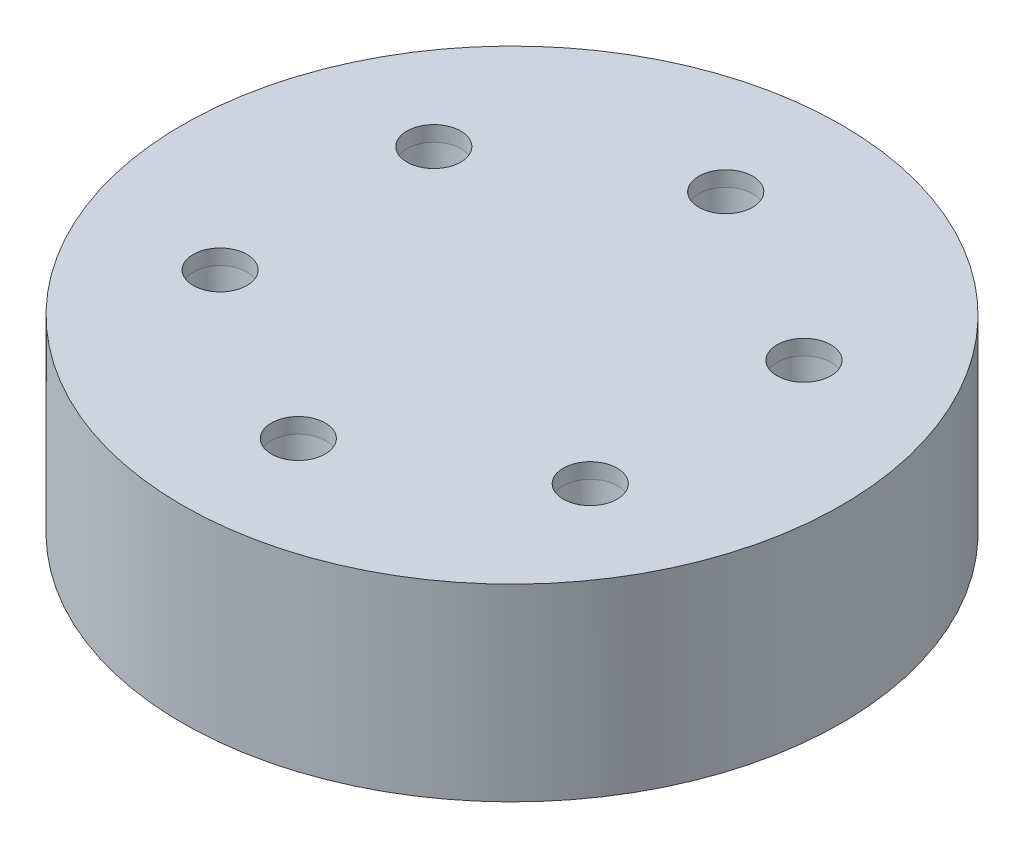
ISO-10303-21;
HEADER;
FILE_DESCRIPTION(('STEP AP214'),'2;1');
FILE_NAME('part.step','',(''),(''),'','','');
FILE_SCHEMA(('AUTOMOTIVE_DESIGN { 1 0 10303 214 1 1 1 1 }'));
ENDSEC;
DATA;
#1=APPLICATION_CONTEXT('core data for automotive mechanical design processes');
#2=APPLICATION_PROTOCOL_DEFINITION('international standard','automotive_design',2000,#1);
#3=PRODUCT_CONTEXT('',#1,'mechanical');
#4=PRODUCT('Part','Part','',(#3));
#5=PRODUCT_RELATED_PRODUCT_CATEGORY('part','',(#4));
#6=PRODUCT_DEFINITION_FORMATION('','',#4);
#7=PRODUCT_DEFINITION_CONTEXT('part definition',#1,'design');
#8=PRODUCT_DEFINITION('design','',#6,#7);
#9=PRODUCT_DEFINITION_SHAPE('','',#8);
#10=(LENGTH_UNIT() NAMED_UNIT(*) SI_UNIT(.MILLI.,.METRE.));
#11=(NAMED_UNIT(*) PLANE_ANGLE_UNIT() SI_UNIT($,.RADIAN.));
#12=(NAMED_UNIT(*) SI_UNIT($,.STERADIAN.) SOLID_ANGLE_UNIT());
#13=UNCERTAINTY_MEASURE_WITH_UNIT(LENGTH_MEASURE(1.E-05),#10,'distance_accuracy_value','');
#14=(GEOMETRIC_REPRESENTATION_CONTEXT(3) GLOBAL_UNCERTAINTY_ASSIGNED_CONTEXT((#13)) GLOBAL_UNIT_ASSIGNED_CONTEXT((#10,
#11,#12)) REPRESENTATION_CONTEXT('',''));
#15=CARTESIAN_POINT('',(0.,0.,0.));
#16=DIRECTION('',(0.,0.,1.));
#17=DIRECTION('',(1.,0.,0.));
#18=AXIS2_PLACEMENT_3D('',#15,#16,#17);
#19=CARTESIAN_POINT('',(0.,0.,0.));
#20=DIRECTION('',(0.,1.,0.));
#21=DIRECTION('',(0.,0.,1.));
#22=AXIS2_PLACEMENT_3D('',#19,#20,#21);
#23=PLANE('',#22);
#24=CARTESIAN_POINT('',(20.6114046100695,0.,-11.9000000000002));
#25=DIRECTION('',(0.,-1.,0.));
#26=DIRECTION('',(0.866025403784433,0.,-0.50000000000001));
#27=AXIS2_PLACEMENT_3D('',#24,#25,#26);
#28=CIRCLE('',#27,2.1);
#29=CARTESIAN_POINT('',(22.4300579580168,0.,-12.9500000000003));
#30=VERTEX_POINT('',#29);
#31=EDGE_CURVE('E165',#30,#30,#28,.T.);
#32=ORIENTED_EDGE('',*,*,#31,.F.);
#33=EDGE_LOOP('',(#32));
#34=FACE_BOUND('',#33,.T.);
#35=CARTESIAN_POINT('',(20.6114046100698,0.,11.8999999999998));
#36=DIRECTION('',(0.,-1.,0.));
#37=DIRECTION('',(0.866025403784443,0.,0.499999999999992));
#38=AXIS2_PLACEMENT_3D('',#35,#36,#37);
#39=CIRCLE('',#38,2.1);
#40=CARTESIAN_POINT('',(22.4300579580171,0.,12.9499999999998));
#41=VERTEX_POINT('',#40);
#42=EDGE_CURVE('E149',#41,#41,#39,.T.);
#43=ORIENTED_EDGE('',*,*,#42,.F.);
#44=EDGE_LOOP('',(#43));
#45=FACE_BOUND('',#44,.T.);
#46=CARTESIAN_POINT('',(0.,0.,23.8));
#47=DIRECTION('',(0.,-1.,0.));
#48=DIRECTION('',(0.,0.,1.));
#49=AXIS2_PLACEMENT_3D('',#46,#47,#48);
#50=CIRCLE('',#49,2.1);
#51=CARTESIAN_POINT('',(0.,0.,25.9));
#52=VERTEX_POINT('',#51);
#53=EDGE_CURVE('E133',#52,#52,#50,.T.);
#54=ORIENTED_EDGE('',*,*,#53,.F.);
#55=EDGE_LOOP('',(#54));
#56=FACE_BOUND('',#55,.T.);
#57=CARTESIAN_POINT('',(-20.6114046100696,0.,11.9000000000001));
#58=DIRECTION('',(0.,-1.,0.));
#59=DIRECTION('',(-0.866025403784436,0.,0.500000000000004));
#60=AXIS2_PLACEMENT_3D('',#57,#58,#59);
#61=CIRCLE('',#60,2.1);
#62=CARTESIAN_POINT('',(-22.4300579580169,0.,12.9500000000001));
#63=VERTEX_POINT('',#62);
#64=EDGE_CURVE('E117',#63,#63,#61,.T.);
#65=ORIENTED_EDGE('',*,*,#64,.F.);
#66=EDGE_LOOP('',(#65));
#67=FACE_BOUND('',#66,.T.);
#68=CARTESIAN_POINT('',(-20.6114046100697,0.,-11.9));
#69=DIRECTION('',(0.,-1.,0.));
#70=DIRECTION('',(-0.86602540378444,0.,-0.499999999999998));
#71=AXIS2_PLACEMENT_3D('',#68,#69,#70);
#72=CIRCLE('',#71,2.1);
#73=CARTESIAN_POINT('',(-22.430057958017,0.,-12.95));
#74=VERTEX_POINT('',#73);
#75=EDGE_CURVE('E101',#74,#74,#72,.T.);
#76=ORIENTED_EDGE('',*,*,#75,.F.);
#77=EDGE_LOOP('',(#76));
#78=FACE_BOUND('',#77,.T.);
#79=CARTESIAN_POINT('',(0.,0.,-23.8));
#80=DIRECTION('',(0.,-1.,0.));
#81=DIRECTION('',(0.,0.,-1.));
#82=AXIS2_PLACEMENT_3D('',#79,#80,#81);
#83=CIRCLE('',#82,2.1);
#84=CARTESIAN_POINT('',(0.,0.,-25.9));
#85=VERTEX_POINT('',#84);
#86=EDGE_CURVE('E65',#85,#85,#83,.T.);
#87=ORIENTED_EDGE('',*,*,#86,.F.);
#88=EDGE_LOOP('',(#87));
#89=FACE_BOUND('',#88,.T.);
#90=CARTESIAN_POINT('',(0.,0.,0.));
#91=DIRECTION('',(0.,-1.,0.));
#92=DIRECTION('',(0.,0.,-1.));
#93=AXIS2_PLACEMENT_3D('',#90,#91,#92);
#94=CIRCLE('',#93,14.1);
#95=CARTESIAN_POINT('',(0.,0.,-14.1));
#96=VERTEX_POINT('',#95);
#97=EDGE_CURVE('E70',#96,#96,#94,.T.);
#98=ORIENTED_EDGE('',*,*,#97,.F.);
#99=EDGE_LOOP('',(#98));
#100=FACE_BOUND('',#99,.T.);
#101=CARTESIAN_POINT('',(0.,0.,0.));
#102=DIRECTION('',(0.,-1.,0.));
#103=DIRECTION('',(0.,0.,-1.));
#104=AXIS2_PLACEMENT_3D('',#101,#102,#103);
#105=CIRCLE('',#104,31.7);
#106=CARTESIAN_POINT('',(0.,0.,-31.7));
#107=VERTEX_POINT('',#106);
#108=EDGE_CURVE('E82',#107,#107,#105,.T.);
#109=ORIENTED_EDGE('',*,*,#108,.T.);
#110=EDGE_LOOP('',(#109));
#111=FACE_BOUND('',#110,.T.);
#112=ADVANCED_FACE('F41',(#34,#45,#56,#67,#78,#89,#100,#111),#23,.F.);
#113=CARTESIAN_POINT('',(0.,11.,0.));
#114=DIRECTION('',(0.,-1.,0.));
#115=DIRECTION('',(0.,0.,-1.));
#116=AXIS2_PLACEMENT_3D('',#113,#114,#115);
#117=CYLINDRICAL_SURFACE('',#116,36.7);
#118=CARTESIAN_POINT('',(0.,11.,0.));
#119=DIRECTION('',(0.,1.,0.));
#120=DIRECTION('',(0.,0.,1.));
#121=AXIS2_PLACEMENT_3D('',#118,#119,#120);
#122=CIRCLE('',#121,36.7);
#123=CARTESIAN_POINT('',(0.,11.,36.7));
#124=VERTEX_POINT('',#123);
#125=EDGE_CURVE('E10',#124,#124,#122,.T.);
#126=ORIENTED_EDGE('',*,*,#125,.F.);
#127=EDGE_LOOP('',(#126));
#128=FACE_BOUND('',#127,.T.);
#129=CARTESIAN_POINT('',(0.,-10.,0.));
#130=DIRECTION('',(0.,-1.,0.));
#131=DIRECTION('',(0.,0.,-1.));
#132=AXIS2_PLACEMENT_3D('',#129,#130,#131);
#133=CIRCLE('',#132,36.7);
#134=CARTESIAN_POINT('',(0.,-10.,-36.7));
#135=VERTEX_POINT('',#134);
#136=EDGE_CURVE('E74',#135,#135,#133,.T.);
#137=ORIENTED_EDGE('',*,*,#136,.F.);
#138=EDGE_LOOP('',(#137));
#139=FACE_BOUND('',#138,.T.);
#140=ADVANCED_FACE('F43',(#128,#139),#117,.T.);
#141=CARTESIAN_POINT('',(0.,11.,0.));
#142=DIRECTION('',(0.,1.,0.));
#143=DIRECTION('',(0.,0.,1.));
#144=AXIS2_PLACEMENT_3D('',#141,#142,#143);
#145=PLANE('',#144);
#146=CARTESIAN_POINT('',(20.6114046100695,11.,-11.9000000000002));
#147=DIRECTION('',(0.,-1.,0.));
#148=DIRECTION('',(0.866025403784433,0.,-0.50000000000001));
#149=AXIS2_PLACEMENT_3D('',#146,#147,#148);
#150=CIRCLE('',#149,3.);
#151=CARTESIAN_POINT('',(23.2094808214228,11.,-13.4000000000003));
#152=VERTEX_POINT('',#151);
#153=EDGE_CURVE('E153',#152,#152,#150,.T.);
#154=ORIENTED_EDGE('',*,*,#153,.T.);
#155=EDGE_LOOP('',(#154));
#156=FACE_BOUND('',#155,.T.);
#157=CARTESIAN_POINT('',(20.6114046100698,11.,11.8999999999998));
#158=DIRECTION('',(0.,-1.,0.));
#159=DIRECTION('',(0.866025403784443,0.,0.499999999999992));
#160=AXIS2_PLACEMENT_3D('',#157,#158,#159);
#161=CIRCLE('',#160,3.);
#162=CARTESIAN_POINT('',(23.2094808214231,11.,13.3999999999998));
#163=VERTEX_POINT('',#162);
#164=EDGE_CURVE('E137',#163,#163,#161,.T.);
#165=ORIENTED_EDGE('',*,*,#164,.T.);
#166=EDGE_LOOP('',(#165));
#167=FACE_BOUND('',#166,.T.);
#168=CARTESIAN_POINT('',(0.,11.,23.8));
#169=DIRECTION('',(0.,-1.,0.));
#170=DIRECTION('',(0.,0.,1.));
#171=AXIS2_PLACEMENT_3D('',#168,#169,#170);
#172=CIRCLE('',#171,3.);
#173=CARTESIAN_POINT('',(0.,11.,26.8));
#174=VERTEX_POINT('',#173);
#175=EDGE_CURVE('E121',#174,#174,#172,.T.);
#176=ORIENTED_EDGE('',*,*,#175,.T.);
#177=EDGE_LOOP('',(#176));
#178=FACE_BOUND('',#177,.T.);
#179=CARTESIAN_POINT('',(-20.6114046100696,11.,11.9000000000001));
#180=DIRECTION('',(0.,-1.,0.));
#181=DIRECTION('',(-0.866025403784436,0.,0.500000000000004));
#182=AXIS2_PLACEMENT_3D('',#179,#180,#181);
#183=CIRCLE('',#182,3.);
#184=CARTESIAN_POINT('',(-23.2094808214229,11.,13.4000000000001));
#185=VERTEX_POINT('',#184);
#186=EDGE_CURVE('E105',#185,#185,#183,.T.);
#187=ORIENTED_EDGE('',*,*,#186,.T.);
#188=EDGE_LOOP('',(#187));
#189=FACE_BOUND('',#188,.T.);
#190=CARTESIAN_POINT('',(-20.6114046100697,11.,-11.9));
#191=DIRECTION('',(0.,-1.,0.));
#192=DIRECTION('',(-0.86602540378444,0.,-0.499999999999998));
#193=AXIS2_PLACEMENT_3D('',#190,#191,#192);
#194=CIRCLE('',#193,3.);
#195=CARTESIAN_POINT('',(-23.209480821423,11.,-13.3999999999999));
#196=VERTEX_POINT('',#195);
#197=EDGE_CURVE('E86',#196,#196,#194,.T.);
#198=ORIENTED_EDGE('',*,*,#197,.T.);
#199=EDGE_LOOP('',(#198));
#200=FACE_BOUND('',#199,.T.);
#201=CARTESIAN_POINT('',(0.,11.,-23.8));
#202=DIRECTION('',(0.,-1.,0.));
#203=DIRECTION('',(0.,0.,-1.));
#204=AXIS2_PLACEMENT_3D('',#201,#202,#203);
#205=CIRCLE('',#204,3.);
#206=CARTESIAN_POINT('',(0.,11.,-26.8));
#207=VERTEX_POINT('',#206);
#208=EDGE_CURVE('E49',#207,#207,#205,.T.);
#209=ORIENTED_EDGE('',*,*,#208,.T.);
#210=EDGE_LOOP('',(#209));
#211=FACE_BOUND('',#210,.T.);
#212=ORIENTED_EDGE('',*,*,#125,.T.);
#213=EDGE_LOOP('',(#212));
#214=FACE_BOUND('',#213,.T.);
#215=ADVANCED_FACE('F224',(#156,#167,#178,#189,#200,#211,#214),#145,.T.);
#216=CARTESIAN_POINT('',(0.,0.,-23.8));
#217=DIRECTION('',(0.,-1.,0.));
#218=DIRECTION('',(0.,0.,-1.));
#219=AXIS2_PLACEMENT_3D('',#216,#217,#218);
#220=CYLINDRICAL_SURFACE('',#219,3.);
#221=ORIENTED_EDGE('',*,*,#208,.F.);
#222=EDGE_LOOP('',(#221));
#223=FACE_BOUND('',#222,.T.);
#224=CARTESIAN_POINT('',(0.,9.3,-23.8));
#225=DIRECTION('',(0.,-1.,0.));
#226=DIRECTION('',(0.,0.,-1.));
#227=AXIS2_PLACEMENT_3D('',#224,#225,#226);
#228=CIRCLE('',#227,3.);
#229=CARTESIAN_POINT('',(0.,9.3,-26.8));
#230=VERTEX_POINT('',#229);
#231=EDGE_CURVE('E54',#230,#230,#228,.T.);
#232=ORIENTED_EDGE('',*,*,#231,.T.);
#233=EDGE_LOOP('',(#232));
#234=FACE_BOUND('',#233,.T.);
#235=ADVANCED_FACE('F220',(#223,#234),#220,.F.);
#236=CARTESIAN_POINT('',(0.,0.5,-23.8));
#237=DIRECTION('',(0.,1.,0.));
#238=DIRECTION('',(0.,0.,1.));
#239=AXIS2_PLACEMENT_3D('',#236,#237,#238);
#240=CONICAL_SURFACE('',#239,2.1,0.101918367480874);
#241=ORIENTED_EDGE('',*,*,#231,.F.);
#242=EDGE_LOOP('',(#241));
#243=FACE_BOUND('',#242,.T.);
#244=CARTESIAN_POINT('',(0.,0.5,-23.8));
#245=DIRECTION('',(0.,-1.,0.));
#246=DIRECTION('',(0.,0.,-1.));
#247=AXIS2_PLACEMENT_3D('',#244,#245,#246);
#248=CIRCLE('',#247,2.1);
#249=CARTESIAN_POINT('',(0.,0.5,-25.9));
#250=VERTEX_POINT('',#249);
#251=EDGE_CURVE('E59',#250,#250,#248,.T.);
#252=ORIENTED_EDGE('',*,*,#251,.T.);
#253=EDGE_LOOP('',(#252));
#254=FACE_BOUND('',#253,.T.);
#255=ADVANCED_FACE('F216',(#243,#254),#240,.F.);
#256=CARTESIAN_POINT('',(0.,0.,-23.8));
#257=DIRECTION('',(0.,-1.,0.));
#258=DIRECTION('',(0.,0.,-1.));
#259=AXIS2_PLACEMENT_3D('',#256,#257,#258);
#260=CYLINDRICAL_SURFACE('',#259,2.1);
#261=ORIENTED_EDGE('',*,*,#251,.F.);
#262=EDGE_LOOP('',(#261));
#263=FACE_BOUND('',#262,.T.);
#264=ORIENTED_EDGE('',*,*,#86,.T.);
#265=EDGE_LOOP('',(#264));
#266=FACE_BOUND('',#265,.T.);
#267=ADVANCED_FACE('F212',(#263,#266),#260,.F.);
#268=CARTESIAN_POINT('',(0.,4.5,0.));
#269=DIRECTION('',(0.,-1.,0.));
#270=DIRECTION('',(0.,0.,-1.));
#271=AXIS2_PLACEMENT_3D('',#268,#269,#270);
#272=CYLINDRICAL_SURFACE('',#271,14.1);
#273=CARTESIAN_POINT('',(0.,4.5,0.));
#274=DIRECTION('',(0.,-1.,0.));
#275=DIRECTION('',(0.,0.,-1.));
#276=AXIS2_PLACEMENT_3D('',#273,#274,#275);
#277=CIRCLE('',#276,14.1);
#278=CARTESIAN_POINT('',(0.,4.5,-14.1));
#279=VERTEX_POINT('',#278);
#280=EDGE_CURVE('E69',#279,#279,#277,.T.);
#281=ORIENTED_EDGE('',*,*,#280,.F.);
#282=EDGE_LOOP('',(#281));
#283=FACE_BOUND('',#282,.T.);
#284=ORIENTED_EDGE('',*,*,#97,.T.);
#285=EDGE_LOOP('',(#284));
#286=FACE_BOUND('',#285,.T.);
#287=ADVANCED_FACE('F208',(#283,#286),#272,.F.);
#288=CARTESIAN_POINT('',(0.,4.5,0.));
#289=DIRECTION('',(0.,-1.,0.));
#290=DIRECTION('',(0.,0.,-1.));
#291=AXIS2_PLACEMENT_3D('',#288,#289,#290);
#292=PLANE('',#291);
#293=ORIENTED_EDGE('',*,*,#280,.T.);
#294=EDGE_LOOP('',(#293));
#295=FACE_BOUND('',#294,.T.);
#296=ADVANCED_FACE('F201',(#295),#292,.T.);
#297=CARTESIAN_POINT('',(0.,-10.,0.));
#298=DIRECTION('',(0.,-1.,0.));
#299=DIRECTION('',(0.,0.,-1.));
#300=AXIS2_PLACEMENT_3D('',#297,#298,#299);
#301=PLANE('',#300);
#302=ORIENTED_EDGE('',*,*,#136,.T.);
#303=EDGE_LOOP('',(#302));
#304=FACE_BOUND('',#303,.T.);
#305=CARTESIAN_POINT('',(0.,-10.,0.));
#306=DIRECTION('',(0.,-1.,0.));
#307=DIRECTION('',(0.,0.,-1.));
#308=AXIS2_PLACEMENT_3D('',#305,#306,#307);
#309=CIRCLE('',#308,31.7);
#310=CARTESIAN_POINT('',(0.,-10.,-31.7));
#311=VERTEX_POINT('',#310);
#312=EDGE_CURVE('E81',#311,#311,#309,.T.);
#313=ORIENTED_EDGE('',*,*,#312,.F.);
#314=EDGE_LOOP('',(#313));
#315=FACE_BOUND('',#314,.T.);
#316=ADVANCED_FACE('F191',(#304,#315),#301,.T.);
#317=CARTESIAN_POINT('',(0.,-10.,0.));
#318=DIRECTION('',(0.,1.,0.));
#319=DIRECTION('',(0.,0.,1.));
#320=AXIS2_PLACEMENT_3D('',#317,#318,#319);
#321=CYLINDRICAL_SURFACE('',#320,31.7);
#322=ORIENTED_EDGE('',*,*,#312,.T.);
#323=EDGE_LOOP('',(#322));
#324=FACE_BOUND('',#323,.T.);
#325=ORIENTED_EDGE('',*,*,#108,.F.);
#326=EDGE_LOOP('',(#325));
#327=FACE_BOUND('',#326,.T.);
#328=ADVANCED_FACE('F188',(#324,#327),#321,.F.);
#329=CARTESIAN_POINT('',(-20.6114046100697,0.,-11.9));
#330=DIRECTION('',(0.,-1.,0.));
#331=DIRECTION('',(-0.86602540378444,0.,-0.499999999999998));
#332=AXIS2_PLACEMENT_3D('',#329,#330,#331);
#333=CYLINDRICAL_SURFACE('',#332,3.);
#334=ORIENTED_EDGE('',*,*,#197,.F.);
#335=EDGE_LOOP('',(#334));
#336=FACE_BOUND('',#335,.T.);
#337=CARTESIAN_POINT('',(-20.6114046100697,9.3,-11.9));
#338=DIRECTION('',(0.,-1.,0.));
#339=DIRECTION('',(-0.86602540378444,0.,-0.499999999999998));
#340=AXIS2_PLACEMENT_3D('',#337,#338,#339);
#341=CIRCLE('',#340,3.);
#342=CARTESIAN_POINT('',(-23.209480821423,9.3,-13.3999999999999));
#343=VERTEX_POINT('',#342);
#344=EDGE_CURVE('E93',#343,#343,#341,.T.);
#345=ORIENTED_EDGE('',*,*,#344,.T.);
#346=EDGE_LOOP('',(#345));
#347=FACE_BOUND('',#346,.T.);
#348=ADVANCED_FACE('F190',(#336,#347),#333,.F.);
#349=CARTESIAN_POINT('',(-20.6114046100697,0.5,-11.9));
#350=DIRECTION('',(0.,1.,0.));
#351=DIRECTION('',(0.86602540378444,0.,0.499999999999998));
#352=AXIS2_PLACEMENT_3D('',#349,#350,#351);
#353=CONICAL_SURFACE('',#352,2.1,0.101918367480874);
#354=ORIENTED_EDGE('',*,*,#344,.F.);
#355=EDGE_LOOP('',(#354));
#356=FACE_BOUND('',#355,.T.);
#357=CARTESIAN_POINT('',(-20.6114046100697,0.5,-11.9));
#358=DIRECTION('',(0.,-1.,0.));
#359=DIRECTION('',(-0.86602540378444,0.,-0.499999999999998));
#360=AXIS2_PLACEMENT_3D('',#357,#358,#359);
#361=CIRCLE('',#360,2.1);
#362=CARTESIAN_POINT('',(-22.430057958017,0.5,-12.95));
#363=VERTEX_POINT('',#362);
#364=EDGE_CURVE('E97',#363,#363,#361,.T.);
#365=ORIENTED_EDGE('',*,*,#364,.T.);
#366=EDGE_LOOP('',(#365));
#367=FACE_BOUND('',#366,.T.);
#368=ADVANCED_FACE('F198',(#356,#367),#353,.F.);
#369=CARTESIAN_POINT('',(-20.6114046100697,0.,-11.9));
#370=DIRECTION('',(0.,-1.,0.));
#371=DIRECTION('',(-0.86602540378444,0.,-0.499999999999998));
#372=AXIS2_PLACEMENT_3D('',#369,#370,#371);
#373=CYLINDRICAL_SURFACE('',#372,2.1);
#374=ORIENTED_EDGE('',*,*,#364,.F.);
#375=EDGE_LOOP('',(#374));
#376=FACE_BOUND('',#375,.T.);
#377=ORIENTED_EDGE('',*,*,#75,.T.);
#378=EDGE_LOOP('',(#377));
#379=FACE_BOUND('',#378,.T.);
#380=ADVANCED_FACE('F246',(#376,#379),#373,.F.);
#381=CARTESIAN_POINT('',(-20.6114046100696,0.,11.9000000000001));
#382=DIRECTION('',(0.,-1.,0.));
#383=DIRECTION('',(-0.866025403784436,0.,0.500000000000004));
#384=AXIS2_PLACEMENT_3D('',#381,#382,#383);
#385=CYLINDRICAL_SURFACE('',#384,3.);
#386=ORIENTED_EDGE('',*,*,#186,.F.);
#387=EDGE_LOOP('',(#386));
#388=FACE_BOUND('',#387,.T.);
#389=CARTESIAN_POINT('',(-20.6114046100696,9.3,11.9000000000001));
#390=DIRECTION('',(0.,-1.,0.));
#391=DIRECTION('',(-0.866025403784436,0.,0.500000000000004));
#392=AXIS2_PLACEMENT_3D('',#389,#390,#391);
#393=CIRCLE('',#392,3.);
#394=CARTESIAN_POINT('',(-23.2094808214229,9.3,13.4000000000001));
#395=VERTEX_POINT('',#394);
#396=EDGE_CURVE('E109',#395,#395,#393,.T.);
#397=ORIENTED_EDGE('',*,*,#396,.T.);
#398=EDGE_LOOP('',(#397));
#399=FACE_BOUND('',#398,.T.);
#400=ADVANCED_FACE('F251',(#388,#399),#385,.F.);
#401=CARTESIAN_POINT('',(-20.6114046100696,0.5,11.9000000000001));
#402=DIRECTION('',(0.,1.,0.));
#403=DIRECTION('',(0.866025403784436,0.,-0.500000000000004));
#404=AXIS2_PLACEMENT_3D('',#401,#402,#403);
#405=CONICAL_SURFACE('',#404,2.1,0.101918367480874);
#406=ORIENTED_EDGE('',*,*,#396,.F.);
#407=EDGE_LOOP('',(#406));
#408=FACE_BOUND('',#407,.T.);
#409=CARTESIAN_POINT('',(-20.6114046100696,0.5,11.9000000000001));
#410=DIRECTION('',(0.,-1.,0.));
#411=DIRECTION('',(-0.866025403784436,0.,0.500000000000004));
#412=AXIS2_PLACEMENT_3D('',#409,#410,#411);
#413=CIRCLE('',#412,2.1);
#414=CARTESIAN_POINT('',(-22.4300579580169,0.5,12.9500000000001));
#415=VERTEX_POINT('',#414);
#416=EDGE_CURVE('E113',#415,#415,#413,.T.);
#417=ORIENTED_EDGE('',*,*,#416,.T.);
#418=EDGE_LOOP('',(#417));
#419=FACE_BOUND('',#418,.T.);
#420=ADVANCED_FACE('F256',(#408,#419),#405,.F.);
#421=CARTESIAN_POINT('',(-20.6114046100696,0.,11.9000000000001));
#422=DIRECTION('',(0.,-1.,0.));
#423=DIRECTION('',(-0.866025403784436,0.,0.500000000000004));
#424=AXIS2_PLACEMENT_3D('',#421,#422,#423);
#425=CYLINDRICAL_SURFACE('',#424,2.1);
#426=ORIENTED_EDGE('',*,*,#416,.F.);
#427=EDGE_LOOP('',(#426));
#428=FACE_BOUND('',#427,.T.);
#429=ORIENTED_EDGE('',*,*,#64,.T.);
#430=EDGE_LOOP('',(#429));
#431=FACE_BOUND('',#430,.T.);
#432=ADVANCED_FACE('F262',(#428,#431),#425,.F.);
#433=CARTESIAN_POINT('',(0.,0.,23.8));
#434=DIRECTION('',(0.,-1.,0.));
#435=DIRECTION('',(0.,0.,1.));
#436=AXIS2_PLACEMENT_3D('',#433,#434,#435);
#437=CYLINDRICAL_SURFACE('',#436,3.);
#438=ORIENTED_EDGE('',*,*,#175,.F.);
#439=EDGE_LOOP('',(#438));
#440=FACE_BOUND('',#439,.T.);
#441=CARTESIAN_POINT('',(0.,9.3,23.8));
#442=DIRECTION('',(0.,-1.,0.));
#443=DIRECTION('',(0.,0.,1.));
#444=AXIS2_PLACEMENT_3D('',#441,#442,#443);
#445=CIRCLE('',#444,3.);
#446=CARTESIAN_POINT('',(0.,9.3,26.8));
#447=VERTEX_POINT('',#446);
#448=EDGE_CURVE('E125',#447,#447,#445,.T.);
#449=ORIENTED_EDGE('',*,*,#448,.T.);
#450=EDGE_LOOP('',(#449));
#451=FACE_BOUND('',#450,.T.);
#452=ADVANCED_FACE('F266',(#440,#451),#437,.F.);
#453=CARTESIAN_POINT('',(0.,0.5,23.8));
#454=DIRECTION('',(0.,1.,0.));
#455=DIRECTION('',(0.,0.,-1.));
#456=AXIS2_PLACEMENT_3D('',#453,#454,#455);
#457=CONICAL_SURFACE('',#456,2.1,0.101918367480874);
#458=ORIENTED_EDGE('',*,*,#448,.F.);
#459=EDGE_LOOP('',(#458));
#460=FACE_BOUND('',#459,.T.);
#461=CARTESIAN_POINT('',(0.,0.5,23.8));
#462=DIRECTION('',(0.,-1.,0.));
#463=DIRECTION('',(0.,0.,1.));
#464=AXIS2_PLACEMENT_3D('',#461,#462,#463);
#465=CIRCLE('',#464,2.1);
#466=CARTESIAN_POINT('',(0.,0.5,25.9));
#467=VERTEX_POINT('',#466);
#468=EDGE_CURVE('E129',#467,#467,#465,.T.);
#469=ORIENTED_EDGE('',*,*,#468,.T.);
#470=EDGE_LOOP('',(#469));
#471=FACE_BOUND('',#470,.T.);
#472=ADVANCED_FACE('F270',(#460,#471),#457,.F.);
#473=CARTESIAN_POINT('',(0.,0.,23.8));
#474=DIRECTION('',(0.,-1.,0.));
#475=DIRECTION('',(0.,0.,1.));
#476=AXIS2_PLACEMENT_3D('',#473,#474,#475);
#477=CYLINDRICAL_SURFACE('',#476,2.1);
#478=ORIENTED_EDGE('',*,*,#468,.F.);
#479=EDGE_LOOP('',(#478));
#480=FACE_BOUND('',#479,.T.);
#481=ORIENTED_EDGE('',*,*,#53,.T.);
#482=EDGE_LOOP('',(#481));
#483=FACE_BOUND('',#482,.T.);
#484=ADVANCED_FACE('F274',(#480,#483),#477,.F.);
#485=CARTESIAN_POINT('',(20.6114046100698,0.,11.8999999999998));
#486=DIRECTION('',(0.,-1.,0.));
#487=DIRECTION('',(0.866025403784443,0.,0.499999999999992));
#488=AXIS2_PLACEMENT_3D('',#485,#486,#487);
#489=CYLINDRICAL_SURFACE('',#488,3.);
#490=ORIENTED_EDGE('',*,*,#164,.F.);
#491=EDGE_LOOP('',(#490));
#492=FACE_BOUND('',#491,.T.);
#493=CARTESIAN_POINT('',(20.6114046100698,9.3,11.8999999999998));
#494=DIRECTION('',(0.,-1.,0.));
#495=DIRECTION('',(0.866025403784443,0.,0.499999999999992));
#496=AXIS2_PLACEMENT_3D('',#493,#494,#495);
#497=CIRCLE('',#496,3.);
#498=CARTESIAN_POINT('',(23.2094808214231,9.3,13.3999999999998));
#499=VERTEX_POINT('',#498);
#500=EDGE_CURVE('E141',#499,#499,#497,.T.);
#501=ORIENTED_EDGE('',*,*,#500,.T.);
#502=EDGE_LOOP('',(#501));
#503=FACE_BOUND('',#502,.T.);
#504=ADVANCED_FACE('F278',(#492,#503),#489,.F.);
#505=CARTESIAN_POINT('',(20.6114046100698,0.5,11.8999999999998));
#506=DIRECTION('',(0.,1.,0.));
#507=DIRECTION('',(-0.866025403784443,0.,-0.499999999999992));
#508=AXIS2_PLACEMENT_3D('',#505,#506,#507);
#509=CONICAL_SURFACE('',#508,2.1,0.101918367480874);
#510=ORIENTED_EDGE('',*,*,#500,.F.);
#511=EDGE_LOOP('',(#510));
#512=FACE_BOUND('',#511,.T.);
#513=CARTESIAN_POINT('',(20.6114046100698,0.5,11.8999999999998));
#514=DIRECTION('',(0.,-1.,0.));
#515=DIRECTION('',(0.866025403784443,0.,0.499999999999992));
#516=AXIS2_PLACEMENT_3D('',#513,#514,#515);
#517=CIRCLE('',#516,2.1);
#518=CARTESIAN_POINT('',(22.4300579580171,0.5,12.9499999999998));
#519=VERTEX_POINT('',#518);
#520=EDGE_CURVE('E145',#519,#519,#517,.T.);
#521=ORIENTED_EDGE('',*,*,#520,.T.);
#522=EDGE_LOOP('',(#521));
#523=FACE_BOUND('',#522,.T.);
#524=ADVANCED_FACE('F282',(#512,#523),#509,.F.);
#525=CARTESIAN_POINT('',(20.6114046100698,0.,11.8999999999998));
#526=DIRECTION('',(0.,-1.,0.));
#527=DIRECTION('',(0.866025403784443,0.,0.499999999999992));
#528=AXIS2_PLACEMENT_3D('',#525,#526,#527);
#529=CYLINDRICAL_SURFACE('',#528,2.1);
#530=ORIENTED_EDGE('',*,*,#520,.F.);
#531=EDGE_LOOP('',(#530));
#532=FACE_BOUND('',#531,.T.);
#533=ORIENTED_EDGE('',*,*,#42,.T.);
#534=EDGE_LOOP('',(#533));
#535=FACE_BOUND('',#534,.T.);
#536=ADVANCED_FACE('F286',(#532,#535),#529,.F.);
#537=CARTESIAN_POINT('',(20.6114046100695,0.,-11.9000000000002));
#538=DIRECTION('',(0.,-1.,0.));
#539=DIRECTION('',(0.866025403784433,0.,-0.50000000000001));
#540=AXIS2_PLACEMENT_3D('',#537,#538,#539);
#541=CYLINDRICAL_SURFACE('',#540,3.);
#542=ORIENTED_EDGE('',*,*,#153,.F.);
#543=EDGE_LOOP('',(#542));
#544=FACE_BOUND('',#543,.T.);
#545=CARTESIAN_POINT('',(20.6114046100695,9.3,-11.9000000000002));
#546=DIRECTION('',(0.,-1.,0.));
#547=DIRECTION('',(0.866025403784433,0.,-0.50000000000001));
#548=AXIS2_PLACEMENT_3D('',#545,#546,#547);
#549=CIRCLE('',#548,3.);
#550=CARTESIAN_POINT('',(23.2094808214228,9.3,-13.4000000000003));
#551=VERTEX_POINT('',#550);
#552=EDGE_CURVE('E157',#551,#551,#549,.T.);
#553=ORIENTED_EDGE('',*,*,#552,.T.);
#554=EDGE_LOOP('',(#553));
#555=FACE_BOUND('',#554,.T.);
#556=ADVANCED_FACE('F290',(#544,#555),#541,.F.);
#557=CARTESIAN_POINT('',(20.6114046100695,0.5,-11.9000000000002));
#558=DIRECTION('',(0.,1.,0.));
#559=DIRECTION('',(-0.866025403784433,0.,0.50000000000001));
#560=AXIS2_PLACEMENT_3D('',#557,#558,#559);
#561=CONICAL_SURFACE('',#560,2.1,0.101918367480874);
#562=ORIENTED_EDGE('',*,*,#552,.F.);
#563=EDGE_LOOP('',(#562));
#564=FACE_BOUND('',#563,.T.);
#565=CARTESIAN_POINT('',(20.6114046100695,0.5,-11.9000000000002));
#566=DIRECTION('',(0.,-1.,0.));
#567=DIRECTION('',(0.866025403784433,0.,-0.50000000000001));
#568=AXIS2_PLACEMENT_3D('',#565,#566,#567);
#569=CIRCLE('',#568,2.1);
#570=CARTESIAN_POINT('',(22.4300579580168,0.5,-12.9500000000003));
#571=VERTEX_POINT('',#570);
#572=EDGE_CURVE('E161',#571,#571,#569,.T.);
#573=ORIENTED_EDGE('',*,*,#572,.T.);
#574=EDGE_LOOP('',(#573));
#575=FACE_BOUND('',#574,.T.);
#576=ADVANCED_FACE('F294',(#564,#575),#561,.F.);
#577=CARTESIAN_POINT('',(20.6114046100695,0.,-11.9000000000002));
#578=DIRECTION('',(0.,-1.,0.));
#579=DIRECTION('',(0.866025403784433,0.,-0.50000000000001));
#580=AXIS2_PLACEMENT_3D('',#577,#578,#579);
#581=CYLINDRICAL_SURFACE('',#580,2.1);
#582=ORIENTED_EDGE('',*,*,#572,.F.);
#583=EDGE_LOOP('',(#582));
#584=FACE_BOUND('',#583,.T.);
#585=ORIENTED_EDGE('',*,*,#31,.T.);
#586=EDGE_LOOP('',(#585));
#587=FACE_BOUND('',#586,.T.);
#588=ADVANCED_FACE('F170',(#584,#587),#581,.F.);
#589=CLOSED_SHELL('',(#112,#140,#215,#235,#255,#267,#287,#296,#316,#328,#348,#368,#380,#400,
#420,#432,#452,#472,#484,#504,#524,#536,#556,#576,#588));
#590=MANIFOLD_SOLID_BREP('B2',#589);
#591=ADVANCED_BREP_SHAPE_REPRESENTATION('',(#18,#590),#14);
#592=SHAPE_DEFINITION_REPRESENTATION(#9,#591);
ENDSEC;
END-ISO-10303-21;
